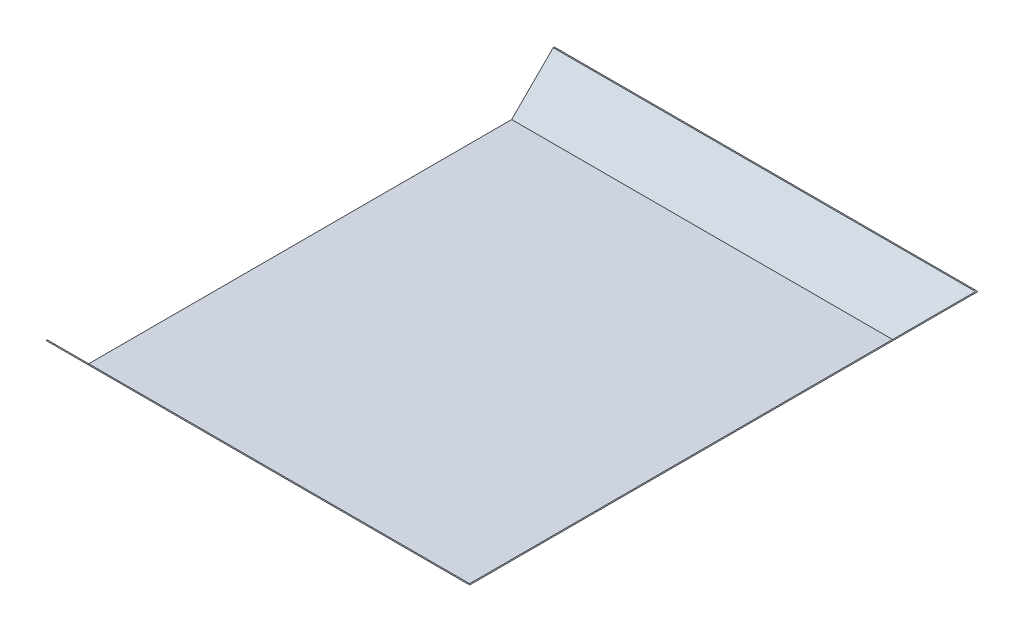
ISO-10303-21;
HEADER;
FILE_DESCRIPTION(('STEP AP214'),'2;1');
FILE_NAME('part.step','',(''),(''),'','','');
FILE_SCHEMA(('AUTOMOTIVE_DESIGN { 1 0 10303 214 1 1 1 1 }'));
ENDSEC;
DATA;
#1=APPLICATION_CONTEXT('core data for automotive mechanical design processes');
#2=APPLICATION_PROTOCOL_DEFINITION('international standard','automotive_design',2000,#1);
#3=PRODUCT_CONTEXT('',#1,'mechanical');
#4=PRODUCT('Part','Part','',(#3));
#5=PRODUCT_RELATED_PRODUCT_CATEGORY('part','',(#4));
#6=PRODUCT_DEFINITION_FORMATION('','',#4);
#7=PRODUCT_DEFINITION_CONTEXT('part definition',#1,'design');
#8=PRODUCT_DEFINITION('design','',#6,#7);
#9=PRODUCT_DEFINITION_SHAPE('','',#8);
#10=(LENGTH_UNIT() NAMED_UNIT(*) SI_UNIT(.MILLI.,.METRE.));
#11=(NAMED_UNIT(*) PLANE_ANGLE_UNIT() SI_UNIT($,.RADIAN.));
#12=(NAMED_UNIT(*) SI_UNIT($,.STERADIAN.) SOLID_ANGLE_UNIT());
#13=UNCERTAINTY_MEASURE_WITH_UNIT(LENGTH_MEASURE(1.E-05),#10,'distance_accuracy_value','');
#14=(GEOMETRIC_REPRESENTATION_CONTEXT(3) GLOBAL_UNCERTAINTY_ASSIGNED_CONTEXT((#13)) GLOBAL_UNIT_ASSIGNED_CONTEXT((#10,
#11,#12)) REPRESENTATION_CONTEXT('',''));
#15=CARTESIAN_POINT('',(0.,0.,0.));
#16=DIRECTION('',(0.,0.,1.));
#17=DIRECTION('',(1.,0.,0.));
#18=AXIS2_PLACEMENT_3D('',#15,#16,#17);
#19=CARTESIAN_POINT('',(-250.,50.,-300.));
#20=DIRECTION('',(1.,0.,0.));
#21=DIRECTION('',(0.,0.,-1.));
#22=AXIS2_PLACEMENT_3D('',#19,#20,#21);
#23=PLANE('',#22);
#24=DIRECTION('',(0.,0.707106781186546,-0.707106781186549));
#25=VECTOR('',#24,1.);
#26=CARTESIAN_POINT('',(-250.,50.7071067811866,-299.292893218813));
#27=LINE('',#26,#25);
#28=CARTESIAN_POINT('',(-250.,50.,-298.585786437627));
#29=VERTEX_POINT('',#28);
#30=CARTESIAN_POINT('',(-250.,1.,-249.585786437627));
#31=VERTEX_POINT('',#30);
#32=EDGE_CURVE('E122',#29,#31,#27,.F.);
#33=ORIENTED_EDGE('',*,*,#32,.F.);
#34=DIRECTION('',(0.,0.,1.));
#35=VECTOR('',#34,1.);
#36=CARTESIAN_POINT('',(-250.,50.,-300.));
#37=LINE('',#36,#35);
#38=CARTESIAN_POINT('',(-250.,50.,-300.));
#39=VERTEX_POINT('',#38);
#40=EDGE_CURVE('E172',#39,#29,#37,.T.);
#41=ORIENTED_EDGE('',*,*,#40,.F.);
#42=DIRECTION('',(0.,0.707106781186546,-0.707106781186549));
#43=VECTOR('',#42,1.);
#44=CARTESIAN_POINT('',(-250.,50.,-300.));
#45=LINE('',#44,#43);
#46=CARTESIAN_POINT('',(-250.,0.,-250.));
#47=VERTEX_POINT('',#46);
#48=EDGE_CURVE('E186',#39,#47,#45,.F.);
#49=ORIENTED_EDGE('',*,*,#48,.T.);
#50=DIRECTION('',(0.,0.,1.));
#51=VECTOR('',#50,1.);
#52=CARTESIAN_POINT('',(-250.,0.,-300.));
#53=LINE('',#52,#51);
#54=CARTESIAN_POINT('',(-250.,0.,250.));
#55=VERTEX_POINT('',#54);
#56=EDGE_CURVE('E167',#47,#55,#53,.T.);
#57=ORIENTED_EDGE('',*,*,#56,.T.);
#58=DIRECTION('',(0.,-0.707106781186546,-0.707106781186549));
#59=VECTOR('',#58,1.);
#60=CARTESIAN_POINT('',(-250.,50.,300.));
#61=LINE('',#60,#59);
#62=CARTESIAN_POINT('',(-250.,50.,300.));
#63=VERTEX_POINT('',#62);
#64=EDGE_CURVE('E179',#55,#63,#61,.F.);
#65=ORIENTED_EDGE('',*,*,#64,.T.);
#66=CARTESIAN_POINT('',(-250.,50.,298.585786437627));
#67=VERTEX_POINT('',#66);
#68=EDGE_CURVE('E171',#67,#63,#37,.T.);
#69=ORIENTED_EDGE('',*,*,#68,.F.);
#70=DIRECTION('',(0.,-0.707106781186546,-0.707106781186549));
#71=VECTOR('',#70,1.);
#72=CARTESIAN_POINT('',(-250.,50.7071067811866,299.292893218813));
#73=LINE('',#72,#71);
#74=CARTESIAN_POINT('',(-250.,1.,249.585786437627));
#75=VERTEX_POINT('',#74);
#76=EDGE_CURVE('E66',#75,#67,#73,.F.);
#77=ORIENTED_EDGE('',*,*,#76,.F.);
#78=DIRECTION('',(0.,0.,1.));
#79=VECTOR('',#78,1.);
#80=CARTESIAN_POINT('',(-250.,1.,-300.));
#81=LINE('',#80,#79);
#82=EDGE_CURVE('E145',#31,#75,#81,.T.);
#83=ORIENTED_EDGE('',*,*,#82,.F.);
#84=EDGE_LOOP('',(#33,#41,#49,#57,#65,#69,#77,#83));
#85=FACE_BOUND('',#84,.T.);
#86=ADVANCED_FACE('F47',(#85),#23,.F.);
#87=CARTESIAN_POINT('',(0.,50.,0.));
#88=DIRECTION('',(0.,1.,0.));
#89=DIRECTION('',(0.,0.,1.));
#90=AXIS2_PLACEMENT_3D('',#87,#88,#89);
#91=PLANE('',#90);
#92=DIRECTION('',(1.,0.,0.));
#93=VECTOR('',#92,1.);
#94=CARTESIAN_POINT('',(0.,50.,-298.585786437627));
#95=LINE('',#94,#93);
#96=CARTESIAN_POINT('',(248.585786437627,50.,-298.585786437627));
#97=VERTEX_POINT('',#96);
#98=EDGE_CURVE('E156',#97,#29,#95,.F.);
#99=ORIENTED_EDGE('',*,*,#98,.F.);
#100=DIRECTION('',(0.,0.,1.));
#101=VECTOR('',#100,1.);
#102=CARTESIAN_POINT('',(248.585786437627,50.,0.));
#103=LINE('',#102,#101);
#104=CARTESIAN_POINT('',(248.585786437627,50.,298.585786437627));
#105=VERTEX_POINT('',#104);
#106=EDGE_CURVE('E140',#105,#97,#103,.F.);
#107=ORIENTED_EDGE('',*,*,#106,.F.);
#108=DIRECTION('',(-1.,0.,0.));
#109=VECTOR('',#108,1.);
#110=CARTESIAN_POINT('',(0.,50.,298.585786437627));
#111=LINE('',#110,#109);
#112=EDGE_CURVE('E153',#67,#105,#111,.F.);
#113=ORIENTED_EDGE('',*,*,#112,.F.);
#114=ORIENTED_EDGE('',*,*,#68,.T.);
#115=DIRECTION('',(1.,0.,0.));
#116=VECTOR('',#115,1.);
#117=CARTESIAN_POINT('',(-250.,50.,300.));
#118=LINE('',#117,#116);
#119=CARTESIAN_POINT('',(250.,50.,300.));
#120=VERTEX_POINT('',#119);
#121=EDGE_CURVE('E176',#63,#120,#118,.T.);
#122=ORIENTED_EDGE('',*,*,#121,.T.);
#123=DIRECTION('',(0.,0.,-1.));
#124=VECTOR('',#123,1.);
#125=CARTESIAN_POINT('',(250.,50.,-300.));
#126=LINE('',#125,#124);
#127=CARTESIAN_POINT('',(250.,50.,-300.));
#128=VERTEX_POINT('',#127);
#129=EDGE_CURVE('E163',#120,#128,#126,.T.);
#130=ORIENTED_EDGE('',*,*,#129,.T.);
#131=DIRECTION('',(-1.,0.,0.));
#132=VECTOR('',#131,1.);
#133=CARTESIAN_POINT('',(-250.,50.,-300.));
#134=LINE('',#133,#132);
#135=EDGE_CURVE('E166',#128,#39,#134,.T.);
#136=ORIENTED_EDGE('',*,*,#135,.T.);
#137=ORIENTED_EDGE('',*,*,#40,.T.);
#138=EDGE_LOOP('',(#99,#107,#113,#114,#122,#130,#136,#137));
#139=FACE_BOUND('',#138,.T.);
#140=ADVANCED_FACE('F214',(#139),#91,.T.);
#141=CARTESIAN_POINT('',(0.,0.,0.));
#142=DIRECTION('',(0.,1.,0.));
#143=DIRECTION('',(0.,0.,1.));
#144=AXIS2_PLACEMENT_3D('',#141,#142,#143);
#145=PLANE('',#144);
#146=ORIENTED_EDGE('',*,*,#56,.F.);
#147=DIRECTION('',(1.,0.,0.));
#148=VECTOR('',#147,1.);
#149=CARTESIAN_POINT('',(0.,0.,-250.));
#150=LINE('',#149,#148);
#151=CARTESIAN_POINT('',(200.,0.,-250.));
#152=VERTEX_POINT('',#151);
#153=EDGE_CURVE('E11',#47,#152,#150,.T.);
#154=ORIENTED_EDGE('',*,*,#153,.T.);
#155=DIRECTION('',(0.,0.,1.));
#156=VECTOR('',#155,1.);
#157=CARTESIAN_POINT('',(200.,0.,0.));
#158=LINE('',#157,#156);
#159=CARTESIAN_POINT('',(200.,0.,250.));
#160=VERTEX_POINT('',#159);
#161=EDGE_CURVE('E58',#152,#160,#158,.T.);
#162=ORIENTED_EDGE('',*,*,#161,.T.);
#163=DIRECTION('',(-1.,0.,0.));
#164=VECTOR('',#163,1.);
#165=CARTESIAN_POINT('',(0.,0.,250.));
#166=LINE('',#165,#164);
#167=EDGE_CURVE('E189',#160,#55,#166,.T.);
#168=ORIENTED_EDGE('',*,*,#167,.T.);
#169=EDGE_LOOP('',(#146,#154,#162,#168));
#170=FACE_BOUND('',#169,.T.);
#171=ADVANCED_FACE('F208',(#170),#145,.F.);
#172=CARTESIAN_POINT('',(-250.,50.,300.));
#173=DIRECTION('',(0.,0.707106781186549,-0.707106781186546));
#174=DIRECTION('',(1.,0.,0.));
#175=AXIS2_PLACEMENT_3D('',#172,#173,#174);
#176=PLANE('',#175);
#177=ORIENTED_EDGE('',*,*,#64,.F.);
#178=ORIENTED_EDGE('',*,*,#167,.F.);
#179=DIRECTION('',(0.577350269189626,0.577350269189624,0.577350269189627));
#180=VECTOR('',#179,1.);
#181=CARTESIAN_POINT('',(83.333333333333,-116.666666666666,133.333333333333));
#182=LINE('',#181,#180);
#183=EDGE_CURVE('E52',#120,#160,#182,.F.);
#184=ORIENTED_EDGE('',*,*,#183,.F.);
#185=ORIENTED_EDGE('',*,*,#121,.F.);
#186=EDGE_LOOP('',(#177,#178,#184,#185));
#187=FACE_BOUND('',#186,.T.);
#188=ADVANCED_FACE('F50',(#187),#176,.F.);
#189=CARTESIAN_POINT('',(250.,50.,-300.));
#190=DIRECTION('',(-0.707106781186546,0.707106781186549,0.));
#191=DIRECTION('',(0.,0.,-1.));
#192=AXIS2_PLACEMENT_3D('',#189,#190,#191);
#193=PLANE('',#192);
#194=ORIENTED_EDGE('',*,*,#183,.T.);
#195=ORIENTED_EDGE('',*,*,#161,.F.);
#196=DIRECTION('',(0.577350269189626,0.577350269189624,-0.577350269189627));
#197=VECTOR('',#196,1.);
#198=CARTESIAN_POINT('',(250.,50.,-300.));
#199=LINE('',#198,#197);
#200=EDGE_CURVE('E127',#128,#152,#199,.F.);
#201=ORIENTED_EDGE('',*,*,#200,.F.);
#202=ORIENTED_EDGE('',*,*,#129,.F.);
#203=EDGE_LOOP('',(#194,#195,#201,#202));
#204=FACE_BOUND('',#203,.T.);
#205=ADVANCED_FACE('F203',(#204),#193,.F.);
#206=CARTESIAN_POINT('',(-250.,50.,-300.));
#207=DIRECTION('',(0.,0.707106781186549,0.707106781186546));
#208=DIRECTION('',(-1.,0.,0.));
#209=AXIS2_PLACEMENT_3D('',#206,#207,#208);
#210=PLANE('',#209);
#211=ORIENTED_EDGE('',*,*,#200,.T.);
#212=ORIENTED_EDGE('',*,*,#153,.F.);
#213=ORIENTED_EDGE('',*,*,#48,.F.);
#214=ORIENTED_EDGE('',*,*,#135,.F.);
#215=EDGE_LOOP('',(#211,#212,#213,#214));
#216=FACE_BOUND('',#215,.T.);
#217=ADVANCED_FACE('F212',(#216),#210,.F.);
#218=CARTESIAN_POINT('',(0.,1.,0.));
#219=DIRECTION('',(0.,1.,0.));
#220=DIRECTION('',(0.,0.,1.));
#221=AXIS2_PLACEMENT_3D('',#218,#219,#220);
#222=PLANE('',#221);
#223=ORIENTED_EDGE('',*,*,#82,.T.);
#224=DIRECTION('',(1.,0.,0.));
#225=VECTOR('',#224,1.);
#226=CARTESIAN_POINT('',(-250.,1.,249.585786437627));
#227=LINE('',#226,#225);
#228=CARTESIAN_POINT('',(199.585786437627,1.,249.585786437627));
#229=VERTEX_POINT('',#228);
#230=EDGE_CURVE('E132',#229,#75,#227,.F.);
#231=ORIENTED_EDGE('',*,*,#230,.F.);
#232=DIRECTION('',(0.,0.,-1.));
#233=VECTOR('',#232,1.);
#234=CARTESIAN_POINT('',(199.585786437627,1.,-300.));
#235=LINE('',#234,#233);
#236=CARTESIAN_POINT('',(199.585786437627,1.,-249.585786437627));
#237=VERTEX_POINT('',#236);
#238=EDGE_CURVE('E128',#237,#229,#235,.F.);
#239=ORIENTED_EDGE('',*,*,#238,.F.);
#240=DIRECTION('',(-1.,0.,0.));
#241=VECTOR('',#240,1.);
#242=CARTESIAN_POINT('',(-250.,1.,-249.585786437627));
#243=LINE('',#242,#241);
#244=EDGE_CURVE('E115',#31,#237,#243,.F.);
#245=ORIENTED_EDGE('',*,*,#244,.F.);
#246=EDGE_LOOP('',(#223,#231,#239,#245));
#247=FACE_BOUND('',#246,.T.);
#248=ADVANCED_FACE('F131',(#247),#222,.T.);
#249=CARTESIAN_POINT('',(-250.,50.7071067811866,299.292893218813));
#250=DIRECTION('',(0.,0.707106781186549,-0.707106781186546));
#251=DIRECTION('',(1.,0.,0.));
#252=AXIS2_PLACEMENT_3D('',#249,#250,#251);
#253=PLANE('',#252);
#254=ORIENTED_EDGE('',*,*,#76,.T.);
#255=ORIENTED_EDGE('',*,*,#112,.T.);
#256=DIRECTION('',(-0.577350269189626,-0.577350269189624,-0.577350269189627));
#257=VECTOR('',#256,1.);
#258=CARTESIAN_POINT('',(49.5285954792084,-149.057190958418,99.5285954792082));
#259=LINE('',#258,#257);
#260=EDGE_CURVE('E142',#105,#229,#259,.T.);
#261=ORIENTED_EDGE('',*,*,#260,.T.);
#262=ORIENTED_EDGE('',*,*,#230,.T.);
#263=EDGE_LOOP('',(#254,#255,#261,#262));
#264=FACE_BOUND('',#263,.T.);
#265=ADVANCED_FACE('F216',(#264),#253,.T.);
#266=CARTESIAN_POINT('',(249.292893218813,50.7071067811866,-300.));
#267=DIRECTION('',(-0.707106781186546,0.707106781186549,0.));
#268=DIRECTION('',(0.,0.,-1.));
#269=AXIS2_PLACEMENT_3D('',#266,#267,#268);
#270=PLANE('',#269);
#271=ORIENTED_EDGE('',*,*,#260,.F.);
#272=ORIENTED_EDGE('',*,*,#106,.T.);
#273=DIRECTION('',(-0.577350269189626,-0.577350269189624,0.577350269189627));
#274=VECTOR('',#273,1.);
#275=CARTESIAN_POINT('',(82.8619288125419,-115.723857625084,-132.861928812542));
#276=LINE('',#275,#274);
#277=EDGE_CURVE('E119',#97,#237,#276,.T.);
#278=ORIENTED_EDGE('',*,*,#277,.T.);
#279=ORIENTED_EDGE('',*,*,#238,.T.);
#280=EDGE_LOOP('',(#271,#272,#278,#279));
#281=FACE_BOUND('',#280,.T.);
#282=ADVANCED_FACE('F138',(#281),#270,.T.);
#283=CARTESIAN_POINT('',(-250.,50.7071067811866,-299.292893218813));
#284=DIRECTION('',(0.,0.707106781186549,0.707106781186546));
#285=DIRECTION('',(-1.,0.,0.));
#286=AXIS2_PLACEMENT_3D('',#283,#284,#285);
#287=PLANE('',#286);
#288=ORIENTED_EDGE('',*,*,#277,.F.);
#289=ORIENTED_EDGE('',*,*,#98,.T.);
#290=ORIENTED_EDGE('',*,*,#32,.T.);
#291=ORIENTED_EDGE('',*,*,#244,.T.);
#292=EDGE_LOOP('',(#288,#289,#290,#291));
#293=FACE_BOUND('',#292,.T.);
#294=ADVANCED_FACE('F117',(#293),#287,.T.);
#295=CLOSED_SHELL('',(#86,#140,#171,#188,#205,#217,#248,#265,#282,#294));
#296=MANIFOLD_SOLID_BREP('B2',#295);
#297=ADVANCED_BREP_SHAPE_REPRESENTATION('',(#18,#296),#14);
#298=SHAPE_DEFINITION_REPRESENTATION(#9,#297);
ENDSEC;
END-ISO-10303-21;
